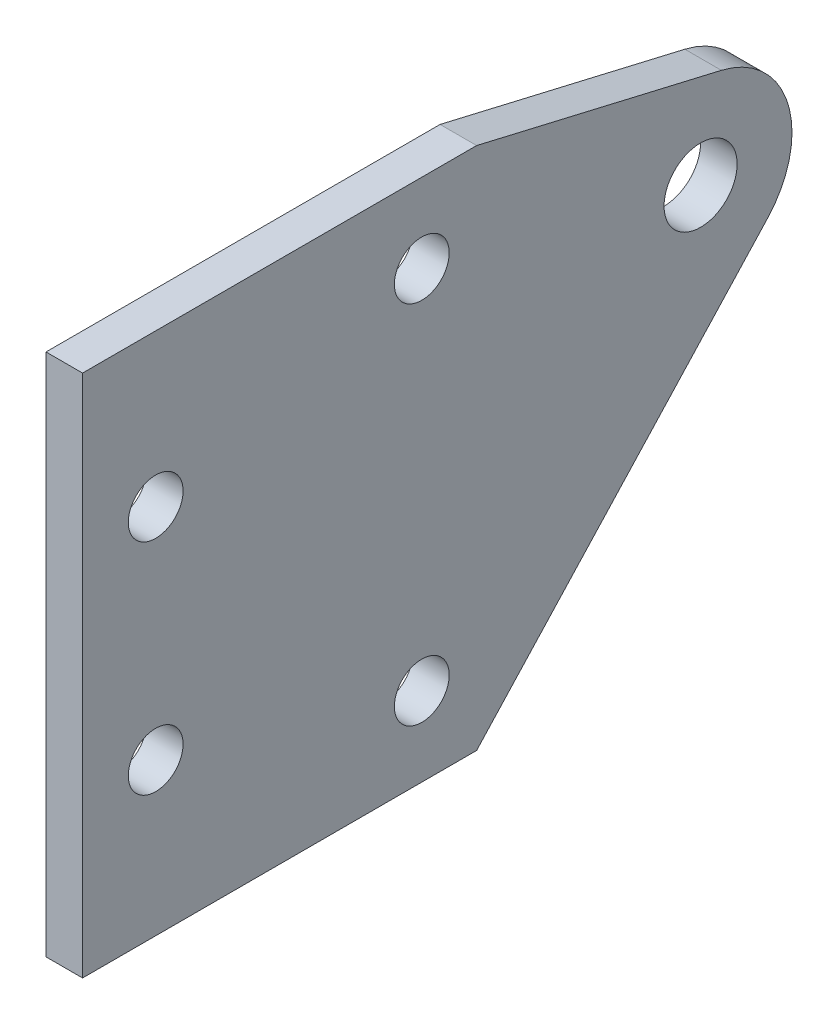
ISO-10303-21;
HEADER;
FILE_DESCRIPTION(('STEP AP214'),'2;1');
FILE_NAME('part.step','',(''),(''),'','','');
FILE_SCHEMA(('AUTOMOTIVE_DESIGN { 1 0 10303 214 1 1 1 1 }'));
ENDSEC;
DATA;
#1=APPLICATION_CONTEXT('core data for automotive mechanical design processes');
#2=APPLICATION_PROTOCOL_DEFINITION('international standard','automotive_design',2000,#1);
#3=PRODUCT_CONTEXT('',#1,'mechanical');
#4=PRODUCT('Part','Part','',(#3));
#5=PRODUCT_RELATED_PRODUCT_CATEGORY('part','',(#4));
#6=PRODUCT_DEFINITION_FORMATION('','',#4);
#7=PRODUCT_DEFINITION_CONTEXT('part definition',#1,'design');
#8=PRODUCT_DEFINITION('design','',#6,#7);
#9=PRODUCT_DEFINITION_SHAPE('','',#8);
#10=(LENGTH_UNIT() NAMED_UNIT(*) SI_UNIT(.MILLI.,.METRE.));
#11=(NAMED_UNIT(*) PLANE_ANGLE_UNIT() SI_UNIT($,.RADIAN.));
#12=(NAMED_UNIT(*) SI_UNIT($,.STERADIAN.) SOLID_ANGLE_UNIT());
#13=UNCERTAINTY_MEASURE_WITH_UNIT(LENGTH_MEASURE(1.E-05),#10,'distance_accuracy_value','');
#14=(GEOMETRIC_REPRESENTATION_CONTEXT(3) GLOBAL_UNCERTAINTY_ASSIGNED_CONTEXT((#13)) GLOBAL_UNIT_ASSIGNED_CONTEXT((#10,
#11,#12)) REPRESENTATION_CONTEXT('',''));
#15=CARTESIAN_POINT('',(0.,0.,0.));
#16=DIRECTION('',(0.,0.,1.));
#17=DIRECTION('',(1.,0.,0.));
#18=AXIS2_PLACEMENT_3D('',#15,#16,#17);
#19=CARTESIAN_POINT('',(-28.5750000000038,366.660683619274,-107.950000000248));
#20=DIRECTION('',(-1.,0.,0.));
#21=DIRECTION('',(0.,0.,1.));
#22=AXIS2_PLACEMENT_3D('',#19,#20,#21);
#23=PLANE('',#22);
#24=CARTESIAN_POINT('',(-28.5750000000038,347.085683619273,-60.6250000002458));
#25=DIRECTION('',(-1.,0.,0.));
#26=DIRECTION('',(0.,0.,1.));
#27=AXIS2_PLACEMENT_3D('',#24,#25,#26);
#28=CIRCLE('',#27,2.38125000000307);
#29=CARTESIAN_POINT('',(-28.5750000000038,347.085683619273,-58.2437500002428));
#30=VERTEX_POINT('',#29);
#31=EDGE_CURVE('E194',#30,#30,#28,.T.);
#32=ORIENTED_EDGE('',*,*,#31,.F.);
#33=EDGE_LOOP('',(#32));
#34=FACE_BOUND('',#33,.T.);
#35=CARTESIAN_POINT('',(-28.5750000000038,340.735683619273,-83.7350000002471));
#36=DIRECTION('',(-1.,0.,0.));
#37=DIRECTION('',(0.,0.,1.));
#38=AXIS2_PLACEMENT_3D('',#35,#36,#37);
#39=CIRCLE('',#38,2.38125000019646);
#40=CARTESIAN_POINT('',(-28.5750000000038,340.735683619273,-81.3537500000507));
#41=VERTEX_POINT('',#40);
#42=EDGE_CURVE('E206',#41,#41,#39,.T.);
#43=ORIENTED_EDGE('',*,*,#42,.F.);
#44=EDGE_LOOP('',(#43));
#45=FACE_BOUND('',#44,.T.);
#46=DIRECTION('',(0.,1.,0.));
#47=VECTOR('',#46,1.);
#48=CARTESIAN_POINT('',(-28.5750000000038,333.860683619273,-54.2750000002426));
#49=LINE('',#48,#47);
#50=CARTESIAN_POINT('',(-28.5750000000038,333.860683619273,-54.2750000002426));
#51=VERTEX_POINT('',#50);
#52=CARTESIAN_POINT('',(-28.5750000000038,379.360683619274,-54.2750000002426));
#53=VERTEX_POINT('',#52);
#54=EDGE_CURVE('E130',#51,#53,#49,.T.);
#55=ORIENTED_EDGE('',*,*,#54,.T.);
#56=DIRECTION('',(0.,0.,-1.));
#57=VECTOR('',#56,1.);
#58=CARTESIAN_POINT('',(-28.5750000000038,379.360683619274,-54.2750000002426));
#59=LINE('',#58,#57);
#60=CARTESIAN_POINT('',(-28.5750000000038,379.360683619274,-88.4975000002387));
#61=VERTEX_POINT('',#60);
#62=EDGE_CURVE('E88',#53,#61,#59,.T.);
#63=ORIENTED_EDGE('',*,*,#62,.T.);
#64=DIRECTION('',(0.,-0.227680094986822,-0.973735988010504));
#65=VECTOR('',#64,1.);
#66=CARTESIAN_POINT('',(-28.5750000000038,379.360683619274,-88.4975000002387));
#67=LINE('',#66,#65);
#68=CARTESIAN_POINT('',(-28.5750000000038,374.389713024107,-109.757210754206));
#69=VERTEX_POINT('',#68);
#70=EDGE_CURVE('E101',#61,#69,#67,.T.);
#71=ORIENTED_EDGE('',*,*,#70,.T.);
#72=CARTESIAN_POINT('',(-28.5750000000038,366.660683619274,-107.950000000248));
#73=DIRECTION('',(-1.,0.,0.));
#74=DIRECTION('',(0.,0.,1.));
#75=AXIS2_PLACEMENT_3D('',#72,#73,#74);
#76=CIRCLE('',#75,7.9375);
#77=CARTESIAN_POINT('',(-28.5750000000038,361.279388429083,-113.784858038455));
#78=VERTEX_POINT('',#77);
#79=EDGE_CURVE('E95',#69,#78,#76,.T.);
#80=ORIENTED_EDGE('',*,*,#79,.T.);
#81=DIRECTION('',(0.,-0.735100225285897,0.677958449157929));
#82=VECTOR('',#81,1.);
#83=CARTESIAN_POINT('',(-28.5750000000038,361.279388429083,-113.784858038455));
#84=LINE('',#83,#82);
#85=CARTESIAN_POINT('',(-28.5750000000038,333.860683619273,-88.4975000002392));
#86=VERTEX_POINT('',#85);
#87=EDGE_CURVE('E99',#78,#86,#84,.T.);
#88=ORIENTED_EDGE('',*,*,#87,.T.);
#89=DIRECTION('',(0.,0.,1.));
#90=VECTOR('',#89,1.);
#91=CARTESIAN_POINT('',(-28.5750000000038,333.860683619273,-88.4975000002392));
#92=LINE('',#91,#90);
#93=EDGE_CURVE('E51',#86,#51,#92,.T.);
#94=ORIENTED_EDGE('',*,*,#93,.T.);
#95=EDGE_LOOP('',(#55,#63,#71,#80,#88,#94));
#96=FACE_BOUND('',#95,.T.);
#97=CARTESIAN_POINT('',(-28.5750000000038,372.485683619273,-83.7350000002471));
#98=DIRECTION('',(-1.,0.,0.));
#99=DIRECTION('',(0.,0.,1.));
#100=AXIS2_PLACEMENT_3D('',#97,#98,#99);
#101=CIRCLE('',#100,2.38125000019646);
#102=CARTESIAN_POINT('',(-28.5750000000038,372.485683619273,-81.3537500000507));
#103=VERTEX_POINT('',#102);
#104=EDGE_CURVE('E123',#103,#103,#101,.T.);
#105=ORIENTED_EDGE('',*,*,#104,.F.);
#106=EDGE_LOOP('',(#105));
#107=FACE_BOUND('',#106,.T.);
#108=CARTESIAN_POINT('',(-28.5750000000038,366.135683619273,-60.6250000002458));
#109=DIRECTION('',(-1.,0.,0.));
#110=DIRECTION('',(0.,0.,1.));
#111=AXIS2_PLACEMENT_3D('',#108,#109,#110);
#112=CIRCLE('',#111,2.38125000000307);
#113=CARTESIAN_POINT('',(-28.5750000000038,366.135683619273,-58.2437500002428));
#114=VERTEX_POINT('',#113);
#115=EDGE_CURVE('E200',#114,#114,#112,.T.);
#116=ORIENTED_EDGE('',*,*,#115,.F.);
#117=EDGE_LOOP('',(#116));
#118=FACE_BOUND('',#117,.T.);
#119=CARTESIAN_POINT('',(-28.5750000000038,366.660683619274,-107.950000000248));
#120=DIRECTION('',(-1.,0.,0.));
#121=DIRECTION('',(0.,0.,1.));
#122=AXIS2_PLACEMENT_3D('',#119,#120,#121);
#123=CIRCLE('',#122,3.175);
#124=CARTESIAN_POINT('',(-28.5750000000038,366.660683619274,-104.775000000248));
#125=VERTEX_POINT('',#124);
#126=EDGE_CURVE('E185',#125,#125,#123,.T.);
#127=ORIENTED_EDGE('',*,*,#126,.F.);
#128=EDGE_LOOP('',(#127));
#129=FACE_BOUND('',#128,.T.);
#130=ADVANCED_FACE('F34',(#34,#45,#96,#107,#118,#129),#23,.T.);
#131=CARTESIAN_POINT('',(-25.4000000000038,366.660683619274,-107.950000000248));
#132=DIRECTION('',(-1.,0.,0.));
#133=DIRECTION('',(0.,0.,1.));
#134=AXIS2_PLACEMENT_3D('',#131,#132,#133);
#135=PLANE('',#134);
#136=DIRECTION('',(0.,1.,0.));
#137=VECTOR('',#136,1.);
#138=CARTESIAN_POINT('',(-25.4000000000038,333.860683619273,-54.2750000002426));
#139=LINE('',#138,#137);
#140=CARTESIAN_POINT('',(-25.4000000000038,333.860683619273,-54.2750000002426));
#141=VERTEX_POINT('',#140);
#142=CARTESIAN_POINT('',(-25.4000000000038,379.360683619274,-54.2750000002426));
#143=VERTEX_POINT('',#142);
#144=EDGE_CURVE('E119',#141,#143,#139,.T.);
#145=ORIENTED_EDGE('',*,*,#144,.F.);
#146=DIRECTION('',(0.,0.,1.));
#147=VECTOR('',#146,1.);
#148=CARTESIAN_POINT('',(-25.4000000000038,333.860683619273,-88.4975000002392));
#149=LINE('',#148,#147);
#150=CARTESIAN_POINT('',(-25.4000000000038,333.860683619273,-88.4975000002392));
#151=VERTEX_POINT('',#150);
#152=EDGE_CURVE('E80',#151,#141,#149,.T.);
#153=ORIENTED_EDGE('',*,*,#152,.F.);
#154=DIRECTION('',(0.,-0.735100225285897,0.677958449157929));
#155=VECTOR('',#154,1.);
#156=CARTESIAN_POINT('',(-25.4000000000038,361.279388429083,-113.784858038455));
#157=LINE('',#156,#155);
#158=CARTESIAN_POINT('',(-25.4000000000038,361.279388429083,-113.784858038455));
#159=VERTEX_POINT('',#158);
#160=EDGE_CURVE('E74',#159,#151,#157,.T.);
#161=ORIENTED_EDGE('',*,*,#160,.F.);
#162=CARTESIAN_POINT('',(-25.4000000000038,366.660683619274,-107.950000000248));
#163=DIRECTION('',(-1.,0.,0.));
#164=DIRECTION('',(0.,0.,1.));
#165=AXIS2_PLACEMENT_3D('',#162,#163,#164);
#166=CIRCLE('',#165,7.9375);
#167=CARTESIAN_POINT('',(-25.4000000000038,374.389713024107,-109.757210754206));
#168=VERTEX_POINT('',#167);
#169=EDGE_CURVE('E109',#168,#159,#166,.T.);
#170=ORIENTED_EDGE('',*,*,#169,.F.);
#171=DIRECTION('',(0.,-0.227680094986822,-0.973735988010504));
#172=VECTOR('',#171,1.);
#173=CARTESIAN_POINT('',(-25.4000000000038,379.360683619274,-88.4975000002387));
#174=LINE('',#173,#172);
#175=CARTESIAN_POINT('',(-25.4000000000038,379.360683619274,-88.4975000002387));
#176=VERTEX_POINT('',#175);
#177=EDGE_CURVE('E125',#176,#168,#174,.T.);
#178=ORIENTED_EDGE('',*,*,#177,.F.);
#179=DIRECTION('',(0.,0.,-1.));
#180=VECTOR('',#179,1.);
#181=CARTESIAN_POINT('',(-25.4000000000038,379.360683619274,-54.2750000002426));
#182=LINE('',#181,#180);
#183=EDGE_CURVE('E122',#143,#176,#182,.T.);
#184=ORIENTED_EDGE('',*,*,#183,.F.);
#185=EDGE_LOOP('',(#145,#153,#161,#170,#178,#184));
#186=FACE_BOUND('',#185,.T.);
#187=CARTESIAN_POINT('',(-25.4000000000038,372.485683619273,-83.7350000002471));
#188=DIRECTION('',(-1.,0.,0.));
#189=DIRECTION('',(0.,0.,1.));
#190=AXIS2_PLACEMENT_3D('',#187,#188,#189);
#191=CIRCLE('',#190,2.38125000019646);
#192=CARTESIAN_POINT('',(-25.4000000000038,372.485683619273,-81.3537500000507));
#193=VERTEX_POINT('',#192);
#194=EDGE_CURVE('E209',#193,#193,#191,.T.);
#195=ORIENTED_EDGE('',*,*,#194,.T.);
#196=EDGE_LOOP('',(#195));
#197=FACE_BOUND('',#196,.T.);
#198=CARTESIAN_POINT('',(-25.4000000000038,340.735683619273,-83.7350000002471));
#199=DIRECTION('',(-1.,0.,0.));
#200=DIRECTION('',(0.,0.,1.));
#201=AXIS2_PLACEMENT_3D('',#198,#199,#200);
#202=CIRCLE('',#201,2.38125000019646);
#203=CARTESIAN_POINT('',(-25.4000000000038,340.735683619273,-81.3537500000507));
#204=VERTEX_POINT('',#203);
#205=EDGE_CURVE('E203',#204,#204,#202,.T.);
#206=ORIENTED_EDGE('',*,*,#205,.T.);
#207=EDGE_LOOP('',(#206));
#208=FACE_BOUND('',#207,.T.);
#209=CARTESIAN_POINT('',(-25.4000000000038,366.135683619273,-60.6250000002458));
#210=DIRECTION('',(-1.,0.,0.));
#211=DIRECTION('',(0.,0.,1.));
#212=AXIS2_PLACEMENT_3D('',#209,#210,#211);
#213=CIRCLE('',#212,2.38125000000307);
#214=CARTESIAN_POINT('',(-25.4000000000038,366.135683619273,-58.2437500002428));
#215=VERTEX_POINT('',#214);
#216=EDGE_CURVE('E197',#215,#215,#213,.T.);
#217=ORIENTED_EDGE('',*,*,#216,.T.);
#218=EDGE_LOOP('',(#217));
#219=FACE_BOUND('',#218,.T.);
#220=CARTESIAN_POINT('',(-25.4000000000038,347.085683619273,-60.6250000002458));
#221=DIRECTION('',(-1.,0.,0.));
#222=DIRECTION('',(0.,0.,1.));
#223=AXIS2_PLACEMENT_3D('',#220,#221,#222);
#224=CIRCLE('',#223,2.38125000000307);
#225=CARTESIAN_POINT('',(-25.4000000000038,347.085683619273,-58.2437500002428));
#226=VERTEX_POINT('',#225);
#227=EDGE_CURVE('E191',#226,#226,#224,.T.);
#228=ORIENTED_EDGE('',*,*,#227,.T.);
#229=EDGE_LOOP('',(#228));
#230=FACE_BOUND('',#229,.T.);
#231=CARTESIAN_POINT('',(-25.4000000000038,366.660683619274,-107.950000000248));
#232=DIRECTION('',(-1.,0.,0.));
#233=DIRECTION('',(0.,0.,1.));
#234=AXIS2_PLACEMENT_3D('',#231,#232,#233);
#235=CIRCLE('',#234,3.175);
#236=CARTESIAN_POINT('',(-25.4000000000038,366.660683619274,-104.775000000248));
#237=VERTEX_POINT('',#236);
#238=EDGE_CURVE('E188',#237,#237,#235,.T.);
#239=ORIENTED_EDGE('',*,*,#238,.T.);
#240=EDGE_LOOP('',(#239));
#241=FACE_BOUND('',#240,.T.);
#242=ADVANCED_FACE('F139',(#186,#197,#208,#219,#230,#241),#135,.F.);
#243=CARTESIAN_POINT('',(-28.5750000000038,333.860683619273,-54.2750000002426));
#244=DIRECTION('',(0.,0.,-1.));
#245=DIRECTION('',(-1.,0.,0.));
#246=AXIS2_PLACEMENT_3D('',#243,#244,#245);
#247=PLANE('',#246);
#248=ORIENTED_EDGE('',*,*,#144,.T.);
#249=DIRECTION('',(1.,0.,0.));
#250=VECTOR('',#249,1.);
#251=CARTESIAN_POINT('',(-28.5750000000038,379.360683619274,-54.2750000002426));
#252=LINE('',#251,#250);
#253=EDGE_CURVE('E11',#53,#143,#252,.T.);
#254=ORIENTED_EDGE('',*,*,#253,.F.);
#255=ORIENTED_EDGE('',*,*,#54,.F.);
#256=DIRECTION('',(1.,0.,0.));
#257=VECTOR('',#256,1.);
#258=CARTESIAN_POINT('',(-28.5750000000038,333.860683619273,-54.2750000002426));
#259=LINE('',#258,#257);
#260=EDGE_CURVE('E115',#51,#141,#259,.T.);
#261=ORIENTED_EDGE('',*,*,#260,.T.);
#262=EDGE_LOOP('',(#248,#254,#255,#261));
#263=FACE_BOUND('',#262,.T.);
#264=ADVANCED_FACE('F36',(#263),#247,.F.);
#265=CARTESIAN_POINT('',(-28.5750000000038,379.360683619274,-54.2750000002426));
#266=DIRECTION('',(0.,-1.,0.));
#267=DIRECTION('',(0.,0.,-1.));
#268=AXIS2_PLACEMENT_3D('',#265,#266,#267);
#269=PLANE('',#268);
#270=ORIENTED_EDGE('',*,*,#183,.T.);
#271=DIRECTION('',(1.,0.,0.));
#272=VECTOR('',#271,1.);
#273=CARTESIAN_POINT('',(-28.5750000000038,379.360683619274,-88.4975000002387));
#274=LINE('',#273,#272);
#275=EDGE_CURVE('E43',#61,#176,#274,.T.);
#276=ORIENTED_EDGE('',*,*,#275,.F.);
#277=ORIENTED_EDGE('',*,*,#62,.F.);
#278=ORIENTED_EDGE('',*,*,#253,.T.);
#279=EDGE_LOOP('',(#270,#276,#277,#278));
#280=FACE_BOUND('',#279,.T.);
#281=ADVANCED_FACE('F276',(#280),#269,.F.);
#282=CARTESIAN_POINT('',(-28.5750000000038,379.360683619274,-88.4975000002387));
#283=DIRECTION('',(0.,-0.973735988010504,0.227680094986822));
#284=DIRECTION('',(0.,-0.227680094986822,-0.973735988010504));
#285=AXIS2_PLACEMENT_3D('',#282,#283,#284);
#286=PLANE('',#285);
#287=ORIENTED_EDGE('',*,*,#177,.T.);
#288=DIRECTION('',(1.,0.,0.));
#289=VECTOR('',#288,1.);
#290=CARTESIAN_POINT('',(-28.5750000000038,374.389713024107,-109.757210754206));
#291=LINE('',#290,#289);
#292=EDGE_CURVE('E110',#69,#168,#291,.T.);
#293=ORIENTED_EDGE('',*,*,#292,.F.);
#294=ORIENTED_EDGE('',*,*,#70,.F.);
#295=ORIENTED_EDGE('',*,*,#275,.T.);
#296=EDGE_LOOP('',(#287,#293,#294,#295));
#297=FACE_BOUND('',#296,.T.);
#298=ADVANCED_FACE('F136',(#297),#286,.F.);
#299=CARTESIAN_POINT('',(-28.5750000000038,366.660683619274,-107.950000000248));
#300=DIRECTION('',(1.,0.,0.));
#301=DIRECTION('',(0.,0.,-1.));
#302=AXIS2_PLACEMENT_3D('',#299,#300,#301);
#303=CYLINDRICAL_SURFACE('',#302,7.9375);
#304=ORIENTED_EDGE('',*,*,#169,.T.);
#305=DIRECTION('',(1.,0.,0.));
#306=VECTOR('',#305,1.);
#307=CARTESIAN_POINT('',(-28.5750000000038,361.279388429083,-113.784858038455));
#308=LINE('',#307,#306);
#309=EDGE_CURVE('E106',#78,#159,#308,.T.);
#310=ORIENTED_EDGE('',*,*,#309,.F.);
#311=ORIENTED_EDGE('',*,*,#79,.F.);
#312=ORIENTED_EDGE('',*,*,#292,.T.);
#313=EDGE_LOOP('',(#304,#310,#311,#312));
#314=FACE_BOUND('',#313,.T.);
#315=ADVANCED_FACE('F107',(#314),#303,.T.);
#316=CARTESIAN_POINT('',(-28.5750000000038,361.279388429083,-113.784858038455));
#317=DIRECTION('',(0.,0.677958449157929,0.735100225285896));
#318=DIRECTION('',(0.,-0.735100225285896,0.677958449157929));
#319=AXIS2_PLACEMENT_3D('',#316,#317,#318);
#320=PLANE('',#319);
#321=ORIENTED_EDGE('',*,*,#160,.T.);
#322=DIRECTION('',(1.,0.,0.));
#323=VECTOR('',#322,1.);
#324=CARTESIAN_POINT('',(-28.5750000000038,333.860683619273,-88.4975000002392));
#325=LINE('',#324,#323);
#326=EDGE_CURVE('E111',#86,#151,#325,.T.);
#327=ORIENTED_EDGE('',*,*,#326,.F.);
#328=ORIENTED_EDGE('',*,*,#87,.F.);
#329=ORIENTED_EDGE('',*,*,#309,.T.);
#330=EDGE_LOOP('',(#321,#327,#328,#329));
#331=FACE_BOUND('',#330,.T.);
#332=ADVANCED_FACE('F113',(#331),#320,.F.);
#333=CARTESIAN_POINT('',(-28.5750000000038,333.860683619273,-88.4975000002392));
#334=DIRECTION('',(0.,1.,0.));
#335=DIRECTION('',(0.,0.,1.));
#336=AXIS2_PLACEMENT_3D('',#333,#334,#335);
#337=PLANE('',#336);
#338=ORIENTED_EDGE('',*,*,#152,.T.);
#339=ORIENTED_EDGE('',*,*,#260,.F.);
#340=ORIENTED_EDGE('',*,*,#93,.F.);
#341=ORIENTED_EDGE('',*,*,#326,.T.);
#342=EDGE_LOOP('',(#338,#339,#340,#341));
#343=FACE_BOUND('',#342,.T.);
#344=ADVANCED_FACE('F144',(#343),#337,.F.);
#345=CARTESIAN_POINT('',(-28.5750000000038,372.485683619273,-83.7350000002471));
#346=DIRECTION('',(1.,0.,0.));
#347=DIRECTION('',(0.,0.,-1.));
#348=AXIS2_PLACEMENT_3D('',#345,#346,#347);
#349=CYLINDRICAL_SURFACE('',#348,2.38125000019646);
#350=ORIENTED_EDGE('',*,*,#104,.T.);
#351=EDGE_LOOP('',(#350));
#352=FACE_BOUND('',#351,.T.);
#353=ORIENTED_EDGE('',*,*,#194,.F.);
#354=EDGE_LOOP('',(#353));
#355=FACE_BOUND('',#354,.T.);
#356=ADVANCED_FACE('F146',(#352,#355),#349,.F.);
#357=CARTESIAN_POINT('',(-28.5750000000038,340.735683619273,-83.7350000002471));
#358=DIRECTION('',(1.,0.,0.));
#359=DIRECTION('',(0.,0.,-1.));
#360=AXIS2_PLACEMENT_3D('',#357,#358,#359);
#361=CYLINDRICAL_SURFACE('',#360,2.38125000019646);
#362=ORIENTED_EDGE('',*,*,#42,.T.);
#363=EDGE_LOOP('',(#362));
#364=FACE_BOUND('',#363,.T.);
#365=ORIENTED_EDGE('',*,*,#205,.F.);
#366=EDGE_LOOP('',(#365));
#367=FACE_BOUND('',#366,.T.);
#368=ADVANCED_FACE('F152',(#364,#367),#361,.F.);
#369=CARTESIAN_POINT('',(-28.5750000000038,366.135683619273,-60.6250000002458));
#370=DIRECTION('',(1.,0.,0.));
#371=DIRECTION('',(0.,0.,-1.));
#372=AXIS2_PLACEMENT_3D('',#369,#370,#371);
#373=CYLINDRICAL_SURFACE('',#372,2.38125000000307);
#374=ORIENTED_EDGE('',*,*,#115,.T.);
#375=EDGE_LOOP('',(#374));
#376=FACE_BOUND('',#375,.T.);
#377=ORIENTED_EDGE('',*,*,#216,.F.);
#378=EDGE_LOOP('',(#377));
#379=FACE_BOUND('',#378,.T.);
#380=ADVANCED_FACE('F168',(#376,#379),#373,.F.);
#381=CARTESIAN_POINT('',(-28.5750000000038,347.085683619273,-60.6250000002458));
#382=DIRECTION('',(1.,0.,0.));
#383=DIRECTION('',(0.,0.,-1.));
#384=AXIS2_PLACEMENT_3D('',#381,#382,#383);
#385=CYLINDRICAL_SURFACE('',#384,2.38125000000307);
#386=ORIENTED_EDGE('',*,*,#31,.T.);
#387=EDGE_LOOP('',(#386));
#388=FACE_BOUND('',#387,.T.);
#389=ORIENTED_EDGE('',*,*,#227,.F.);
#390=EDGE_LOOP('',(#389));
#391=FACE_BOUND('',#390,.T.);
#392=ADVANCED_FACE('F172',(#388,#391),#385,.F.);
#393=CARTESIAN_POINT('',(-28.5750000000038,366.660683619274,-107.950000000248));
#394=DIRECTION('',(1.,0.,0.));
#395=DIRECTION('',(0.,0.,-1.));
#396=AXIS2_PLACEMENT_3D('',#393,#394,#395);
#397=CYLINDRICAL_SURFACE('',#396,3.175);
#398=ORIENTED_EDGE('',*,*,#126,.T.);
#399=EDGE_LOOP('',(#398));
#400=FACE_BOUND('',#399,.T.);
#401=ORIENTED_EDGE('',*,*,#238,.F.);
#402=EDGE_LOOP('',(#401));
#403=FACE_BOUND('',#402,.T.);
#404=ADVANCED_FACE('F176',(#400,#403),#397,.F.);
#405=CLOSED_SHELL('',(#130,#242,#264,#281,#298,#315,#332,#344,#356,#368,#380,#392,#404));
#406=MANIFOLD_SOLID_BREP('B2',#405);
#407=ADVANCED_BREP_SHAPE_REPRESENTATION('',(#18,#406),#14);
#408=SHAPE_DEFINITION_REPRESENTATION(#9,#407);
ENDSEC;
END-ISO-10303-21;
